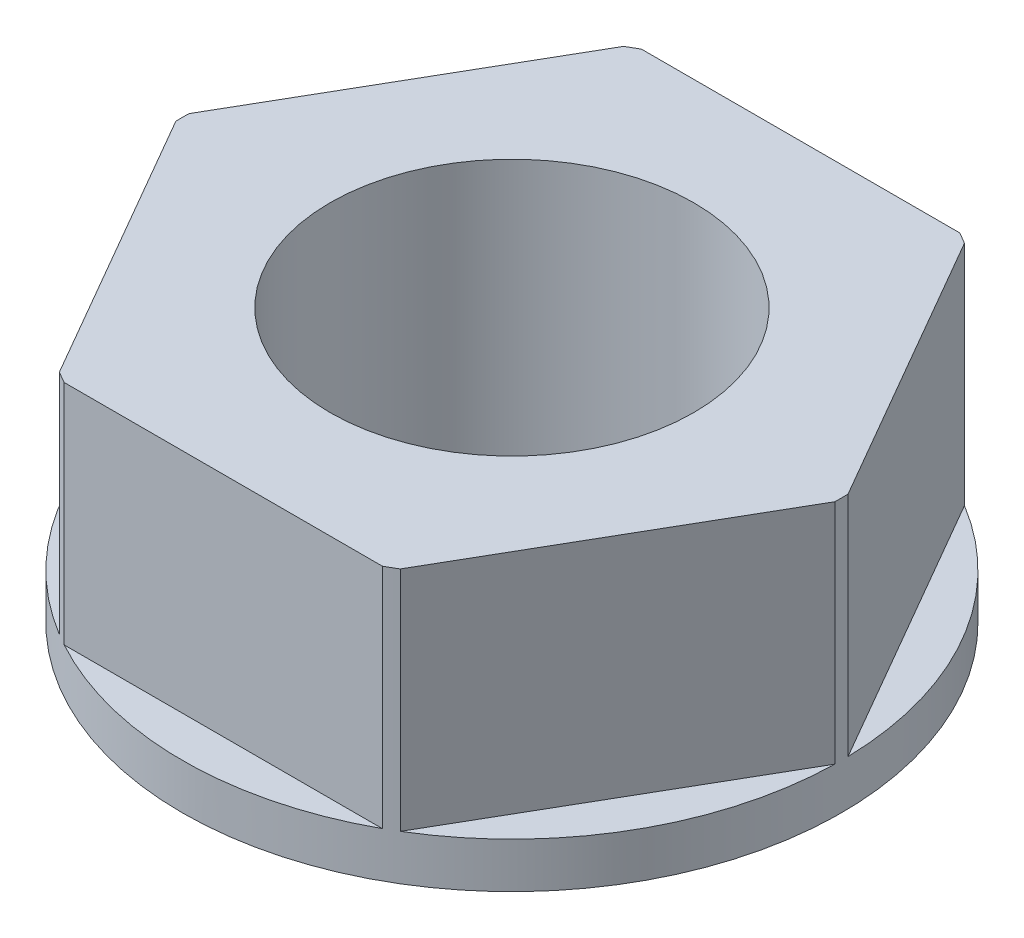
ISO-10303-21;
HEADER;
FILE_DESCRIPTION(('STEP AP214'),'2;1');
FILE_NAME('part.step','',(''),(''),'','','');
FILE_SCHEMA(('AUTOMOTIVE_DESIGN { 1 0 10303 214 1 1 1 1 }'));
ENDSEC;
DATA;
#1=APPLICATION_CONTEXT('core data for automotive mechanical design processes');
#2=APPLICATION_PROTOCOL_DEFINITION('international standard','automotive_design',2000,#1);
#3=PRODUCT_CONTEXT('',#1,'mechanical');
#4=PRODUCT('Part','Part','',(#3));
#5=PRODUCT_RELATED_PRODUCT_CATEGORY('part','',(#4));
#6=PRODUCT_DEFINITION_FORMATION('','',#4);
#7=PRODUCT_DEFINITION_CONTEXT('part definition',#1,'design');
#8=PRODUCT_DEFINITION('design','',#6,#7);
#9=PRODUCT_DEFINITION_SHAPE('','',#8);
#10=(LENGTH_UNIT() NAMED_UNIT(*) SI_UNIT(.MILLI.,.METRE.));
#11=(NAMED_UNIT(*) PLANE_ANGLE_UNIT() SI_UNIT($,.RADIAN.));
#12=(NAMED_UNIT(*) SI_UNIT($,.STERADIAN.) SOLID_ANGLE_UNIT());
#13=UNCERTAINTY_MEASURE_WITH_UNIT(LENGTH_MEASURE(1.E-05),#10,'distance_accuracy_value','');
#14=(GEOMETRIC_REPRESENTATION_CONTEXT(3) GLOBAL_UNCERTAINTY_ASSIGNED_CONTEXT((#13)) GLOBAL_UNIT_ASSIGNED_CONTEXT((#10,
#11,#12)) REPRESENTATION_CONTEXT('',''));
#15=CARTESIAN_POINT('',(0.,0.,0.));
#16=DIRECTION('',(0.,0.,1.));
#17=DIRECTION('',(1.,0.,0.));
#18=AXIS2_PLACEMENT_3D('',#15,#16,#17);
#19=CARTESIAN_POINT('',(0.,1.,0.));
#20=DIRECTION('',(0.,1.,0.));
#21=DIRECTION('',(0.,0.,1.));
#22=AXIS2_PLACEMENT_3D('',#19,#20,#21);
#23=PLANE('',#22);
#24=DIRECTION('',(0.5,0.,-0.866025403784439));
#25=VECTOR('',#24,1.);
#26=CARTESIAN_POINT('',(5.49926131403119,1.,3.175));
#27=LINE('',#26,#25);
#28=CARTESIAN_POINT('',(3.7499757455776,1.,6.20485148150862));
#29=VERTEX_POINT('',#28);
#30=CARTESIAN_POINT('',(7.24854688248478,1.,0.145148518491378));
#31=VERTEX_POINT('',#30);
#32=EDGE_CURVE('E155',#29,#31,#27,.T.);
#33=ORIENTED_EDGE('',*,*,#32,.F.);
#34=CARTESIAN_POINT('',(0.,1.,0.));
#35=DIRECTION('',(0.,1.,0.));
#36=DIRECTION('',(0.,0.,1.));
#37=AXIS2_PLACEMENT_3D('',#34,#35,#36);
#38=CIRCLE('',#37,7.25);
#39=EDGE_CURVE('E11',#29,#31,#38,.T.);
#40=ORIENTED_EDGE('',*,*,#39,.T.);
#41=EDGE_LOOP('',(#33,#40));
#42=FACE_BOUND('',#41,.T.);
#43=ADVANCED_FACE('F45',(#42),#23,.T.);
#44=DIRECTION('',(1.,0.,0.));
#45=VECTOR('',#44,1.);
#46=CARTESIAN_POINT('',(0.,1.,6.35));
#47=LINE('',#46,#45);
#48=CARTESIAN_POINT('',(-3.49857113690718,1.,6.35));
#49=VERTEX_POINT('',#48);
#50=CARTESIAN_POINT('',(3.49857113690718,1.,6.35));
#51=VERTEX_POINT('',#50);
#52=EDGE_CURVE('E61',#49,#51,#47,.T.);
#53=ORIENTED_EDGE('',*,*,#52,.F.);
#54=EDGE_CURVE('E55',#49,#51,#38,.T.);
#55=ORIENTED_EDGE('',*,*,#54,.T.);
#56=EDGE_LOOP('',(#53,#55));
#57=FACE_BOUND('',#56,.T.);
#58=ADVANCED_FACE('F257',(#57),#23,.T.);
#59=DIRECTION('',(0.5,0.,0.866025403784439));
#60=VECTOR('',#59,1.);
#61=CARTESIAN_POINT('',(-5.49926131403118,1.,3.175));
#62=LINE('',#61,#60);
#63=CARTESIAN_POINT('',(-7.24854688248478,1.,0.145148518491375));
#64=VERTEX_POINT('',#63);
#65=CARTESIAN_POINT('',(-3.74997574557759,1.,6.20485148150863));
#66=VERTEX_POINT('',#65);
#67=EDGE_CURVE('E211',#64,#66,#62,.T.);
#68=ORIENTED_EDGE('',*,*,#67,.F.);
#69=EDGE_CURVE('E68',#64,#66,#38,.T.);
#70=ORIENTED_EDGE('',*,*,#69,.T.);
#71=EDGE_LOOP('',(#68,#70));
#72=FACE_BOUND('',#71,.T.);
#73=ADVANCED_FACE('F262',(#72),#23,.T.);
#74=DIRECTION('',(-0.5,0.,0.866025403784439));
#75=VECTOR('',#74,1.);
#76=CARTESIAN_POINT('',(-5.49926131403119,1.,-3.175));
#77=LINE('',#76,#75);
#78=CARTESIAN_POINT('',(-3.7499757455776,1.,-6.20485148150862));
#79=VERTEX_POINT('',#78);
#80=CARTESIAN_POINT('',(-7.24854688248478,1.,-0.145148518491382));
#81=VERTEX_POINT('',#80);
#82=EDGE_CURVE('E209',#79,#81,#77,.T.);
#83=ORIENTED_EDGE('',*,*,#82,.F.);
#84=EDGE_CURVE('E166',#79,#81,#38,.T.);
#85=ORIENTED_EDGE('',*,*,#84,.T.);
#86=EDGE_LOOP('',(#83,#85));
#87=FACE_BOUND('',#86,.T.);
#88=ADVANCED_FACE('F274',(#87),#23,.T.);
#89=DIRECTION('',(-1.,0.,0.));
#90=VECTOR('',#89,1.);
#91=CARTESIAN_POINT('',(0.,1.,-6.35));
#92=LINE('',#91,#90);
#93=CARTESIAN_POINT('',(3.49857113690718,1.,-6.35));
#94=VERTEX_POINT('',#93);
#95=CARTESIAN_POINT('',(-3.49857113690718,1.,-6.35));
#96=VERTEX_POINT('',#95);
#97=EDGE_CURVE('E177',#94,#96,#92,.T.);
#98=ORIENTED_EDGE('',*,*,#97,.F.);
#99=EDGE_CURVE('E167',#94,#96,#38,.T.);
#100=ORIENTED_EDGE('',*,*,#99,.T.);
#101=EDGE_LOOP('',(#98,#100));
#102=FACE_BOUND('',#101,.T.);
#103=ADVANCED_FACE('F266',(#102),#23,.T.);
#104=CARTESIAN_POINT('',(0.,1.,0.));
#105=DIRECTION('',(0.,-1.,0.));
#106=DIRECTION('',(0.,0.,-1.));
#107=AXIS2_PLACEMENT_3D('',#104,#105,#106);
#108=CYLINDRICAL_SURFACE('',#107,7.25);
#109=ORIENTED_EDGE('',*,*,#39,.F.);
#110=DIRECTION('',(0.,-1.,0.));
#111=VECTOR('',#110,1.);
#112=CARTESIAN_POINT('',(3.7499757455776,6.,6.20485148150862));
#113=LINE('',#112,#111);
#114=CARTESIAN_POINT('',(3.7499757455776,6.,6.20485148150862));
#115=VERTEX_POINT('',#114);
#116=EDGE_CURVE('E205',#115,#29,#113,.T.);
#117=ORIENTED_EDGE('',*,*,#116,.F.);
#118=CARTESIAN_POINT('',(0.,6.,0.));
#119=DIRECTION('',(0.,1.,0.));
#120=DIRECTION('',(0.,0.,1.));
#121=AXIS2_PLACEMENT_3D('',#118,#119,#120);
#122=CIRCLE('',#121,7.25);
#123=CARTESIAN_POINT('',(3.49857113690718,6.,6.35));
#124=VERTEX_POINT('',#123);
#125=EDGE_CURVE('E157',#124,#115,#122,.T.);
#126=ORIENTED_EDGE('',*,*,#125,.F.);
#127=DIRECTION('',(0.,-1.,0.));
#128=VECTOR('',#127,1.);
#129=CARTESIAN_POINT('',(3.49857113690718,6.,6.35));
#130=LINE('',#129,#128);
#131=EDGE_CURVE('E218',#124,#51,#130,.T.);
#132=ORIENTED_EDGE('',*,*,#131,.T.);
#133=ORIENTED_EDGE('',*,*,#54,.F.);
#134=DIRECTION('',(0.,-1.,0.));
#135=VECTOR('',#134,1.);
#136=CARTESIAN_POINT('',(-3.49857113690718,6.,6.35));
#137=LINE('',#136,#135);
#138=CARTESIAN_POINT('',(-3.49857113690718,6.,6.35));
#139=VERTEX_POINT('',#138);
#140=EDGE_CURVE('E221',#139,#49,#137,.T.);
#141=ORIENTED_EDGE('',*,*,#140,.F.);
#142=CARTESIAN_POINT('',(-3.74997574557759,6.,6.20485148150863));
#143=VERTEX_POINT('',#142);
#144=EDGE_CURVE('E193',#143,#139,#122,.T.);
#145=ORIENTED_EDGE('',*,*,#144,.F.);
#146=DIRECTION('',(0.,-1.,0.));
#147=VECTOR('',#146,1.);
#148=CARTESIAN_POINT('',(-3.74997574557759,6.,6.20485148150863));
#149=LINE('',#148,#147);
#150=EDGE_CURVE('E224',#143,#66,#149,.T.);
#151=ORIENTED_EDGE('',*,*,#150,.T.);
#152=ORIENTED_EDGE('',*,*,#69,.F.);
#153=DIRECTION('',(0.,-1.,0.));
#154=VECTOR('',#153,1.);
#155=CARTESIAN_POINT('',(-7.24854688248478,6.,0.145148518491375));
#156=LINE('',#155,#154);
#157=CARTESIAN_POINT('',(-7.24854688248478,6.,0.145148518491375));
#158=VERTEX_POINT('',#157);
#159=EDGE_CURVE('E227',#158,#64,#156,.T.);
#160=ORIENTED_EDGE('',*,*,#159,.F.);
#161=CARTESIAN_POINT('',(-7.24854688248478,6.,-0.145148518491382));
#162=VERTEX_POINT('',#161);
#163=EDGE_CURVE('E188',#162,#158,#122,.T.);
#164=ORIENTED_EDGE('',*,*,#163,.F.);
#165=DIRECTION('',(0.,-1.,0.));
#166=VECTOR('',#165,1.);
#167=CARTESIAN_POINT('',(-7.24854688248478,6.,-0.145148518491382));
#168=LINE('',#167,#166);
#169=EDGE_CURVE('E230',#162,#81,#168,.T.);
#170=ORIENTED_EDGE('',*,*,#169,.T.);
#171=ORIENTED_EDGE('',*,*,#84,.F.);
#172=DIRECTION('',(0.,-1.,0.));
#173=VECTOR('',#172,1.);
#174=CARTESIAN_POINT('',(-3.7499757455776,6.,-6.20485148150862));
#175=LINE('',#174,#173);
#176=CARTESIAN_POINT('',(-3.7499757455776,6.,-6.20485148150862));
#177=VERTEX_POINT('',#176);
#178=EDGE_CURVE('E233',#177,#79,#175,.T.);
#179=ORIENTED_EDGE('',*,*,#178,.F.);
#180=CARTESIAN_POINT('',(-3.49857113690718,6.,-6.35));
#181=VERTEX_POINT('',#180);
#182=EDGE_CURVE('E184',#181,#177,#122,.T.);
#183=ORIENTED_EDGE('',*,*,#182,.F.);
#184=DIRECTION('',(0.,-1.,0.));
#185=VECTOR('',#184,1.);
#186=CARTESIAN_POINT('',(-3.49857113690718,6.,-6.35));
#187=LINE('',#186,#185);
#188=EDGE_CURVE('E236',#181,#96,#187,.T.);
#189=ORIENTED_EDGE('',*,*,#188,.T.);
#190=ORIENTED_EDGE('',*,*,#99,.F.);
#191=DIRECTION('',(0.,-1.,0.));
#192=VECTOR('',#191,1.);
#193=CARTESIAN_POINT('',(3.49857113690718,6.,-6.35));
#194=LINE('',#193,#192);
#195=CARTESIAN_POINT('',(3.49857113690718,6.,-6.35));
#196=VERTEX_POINT('',#195);
#197=EDGE_CURVE('E163',#196,#94,#194,.T.);
#198=ORIENTED_EDGE('',*,*,#197,.F.);
#199=CARTESIAN_POINT('',(3.74997574557759,6.,-6.20485148150863));
#200=VERTEX_POINT('',#199);
#201=EDGE_CURVE('E145',#200,#196,#122,.T.);
#202=ORIENTED_EDGE('',*,*,#201,.F.);
#203=DIRECTION('',(0.,-1.,0.));
#204=VECTOR('',#203,1.);
#205=CARTESIAN_POINT('',(3.74997574557759,6.,-6.20485148150863));
#206=LINE('',#205,#204);
#207=CARTESIAN_POINT('',(3.74997574557759,1.,-6.20485148150863));
#208=VERTEX_POINT('',#207);
#209=EDGE_CURVE('E142',#200,#208,#206,.T.);
#210=ORIENTED_EDGE('',*,*,#209,.T.);
#211=CARTESIAN_POINT('',(7.24854688248478,1.,-0.14514851849138));
#212=VERTEX_POINT('',#211);
#213=EDGE_CURVE('E54',#212,#208,#38,.T.);
#214=ORIENTED_EDGE('',*,*,#213,.F.);
#215=DIRECTION('',(0.,-1.,0.));
#216=VECTOR('',#215,1.);
#217=CARTESIAN_POINT('',(7.24854688248478,6.,-0.14514851849138));
#218=LINE('',#217,#216);
#219=CARTESIAN_POINT('',(7.24854688248478,6.,-0.14514851849138));
#220=VERTEX_POINT('',#219);
#221=EDGE_CURVE('E140',#220,#212,#218,.T.);
#222=ORIENTED_EDGE('',*,*,#221,.F.);
#223=CARTESIAN_POINT('',(7.24854688248478,6.,0.145148518491378));
#224=VERTEX_POINT('',#223);
#225=EDGE_CURVE('E146',#224,#220,#122,.T.);
#226=ORIENTED_EDGE('',*,*,#225,.F.);
#227=DIRECTION('',(0.,-1.,0.));
#228=VECTOR('',#227,1.);
#229=CARTESIAN_POINT('',(7.24854688248478,6.,0.145148518491378));
#230=LINE('',#229,#228);
#231=EDGE_CURVE('E203',#224,#31,#230,.T.);
#232=ORIENTED_EDGE('',*,*,#231,.T.);
#233=EDGE_LOOP('',(#109,#117,#126,#132,#133,#141,#145,#151,#152,#160,#164,#170,#171,#179,#183,
#189,#190,#198,#202,#210,#214,#222,#226,#232));
#234=FACE_BOUND('',#233,.T.);
#235=CARTESIAN_POINT('',(0.,0.,0.));
#236=DIRECTION('',(0.,1.,0.));
#237=DIRECTION('',(0.,0.,1.));
#238=AXIS2_PLACEMENT_3D('',#235,#236,#237);
#239=CIRCLE('',#238,7.25);
#240=CARTESIAN_POINT('',(0.,0.,7.25));
#241=VERTEX_POINT('',#240);
#242=EDGE_CURVE('E49',#241,#241,#239,.T.);
#243=ORIENTED_EDGE('',*,*,#242,.T.);
#244=EDGE_LOOP('',(#243));
#245=FACE_BOUND('',#244,.T.);
#246=ADVANCED_FACE('F47',(#234,#245),#108,.T.);
#247=DIRECTION('',(-0.5,0.,-0.866025403784438));
#248=VECTOR('',#247,1.);
#249=CARTESIAN_POINT('',(5.49926131403118,1.,-3.175));
#250=LINE('',#249,#248);
#251=EDGE_CURVE('E176',#212,#208,#250,.T.);
#252=ORIENTED_EDGE('',*,*,#251,.F.);
#253=ORIENTED_EDGE('',*,*,#213,.T.);
#254=EDGE_LOOP('',(#252,#253));
#255=FACE_BOUND('',#254,.T.);
#256=ADVANCED_FACE('F175',(#255),#23,.T.);
#257=CARTESIAN_POINT('',(0.,0.,0.));
#258=DIRECTION('',(0.,1.,0.));
#259=DIRECTION('',(0.,0.,1.));
#260=AXIS2_PLACEMENT_3D('',#257,#258,#259);
#261=PLANE('',#260);
#262=CARTESIAN_POINT('',(0.,0.,0.));
#263=DIRECTION('',(0.,1.,0.));
#264=DIRECTION('',(0.,0.,1.));
#265=AXIS2_PLACEMENT_3D('',#262,#263,#264);
#266=CIRCLE('',#265,4.);
#267=CARTESIAN_POINT('',(0.,0.,4.));
#268=VERTEX_POINT('',#267);
#269=EDGE_CURVE('E178',#268,#268,#266,.T.);
#270=ORIENTED_EDGE('',*,*,#269,.T.);
#271=EDGE_LOOP('',(#270));
#272=FACE_BOUND('',#271,.T.);
#273=ORIENTED_EDGE('',*,*,#242,.F.);
#274=EDGE_LOOP('',(#273));
#275=FACE_BOUND('',#274,.T.);
#276=ADVANCED_FACE('F265',(#272,#275),#261,.F.);
#277=CARTESIAN_POINT('',(5.49926131403118,6.,-3.175));
#278=DIRECTION('',(-0.866025403784438,0.,0.5));
#279=DIRECTION('',(0.5,0.,0.866025403784438));
#280=AXIS2_PLACEMENT_3D('',#277,#278,#279);
#281=PLANE('',#280);
#282=ORIENTED_EDGE('',*,*,#251,.T.);
#283=ORIENTED_EDGE('',*,*,#209,.F.);
#284=DIRECTION('',(-0.5,0.,-0.866025403784438));
#285=VECTOR('',#284,1.);
#286=CARTESIAN_POINT('',(5.49926131403118,6.,-3.175));
#287=LINE('',#286,#285);
#288=EDGE_CURVE('E135',#220,#200,#287,.T.);
#289=ORIENTED_EDGE('',*,*,#288,.F.);
#290=ORIENTED_EDGE('',*,*,#221,.T.);
#291=EDGE_LOOP('',(#282,#283,#289,#290));
#292=FACE_BOUND('',#291,.T.);
#293=ADVANCED_FACE('F138',(#292),#281,.F.);
#294=CARTESIAN_POINT('',(0.,6.,-6.35));
#295=DIRECTION('',(0.,0.,1.));
#296=DIRECTION('',(1.,0.,0.));
#297=AXIS2_PLACEMENT_3D('',#294,#295,#296);
#298=PLANE('',#297);
#299=ORIENTED_EDGE('',*,*,#97,.T.);
#300=ORIENTED_EDGE('',*,*,#188,.F.);
#301=DIRECTION('',(-1.,0.,0.));
#302=VECTOR('',#301,1.);
#303=CARTESIAN_POINT('',(0.,6.,-6.35));
#304=LINE('',#303,#302);
#305=EDGE_CURVE('E183',#196,#181,#304,.T.);
#306=ORIENTED_EDGE('',*,*,#305,.F.);
#307=ORIENTED_EDGE('',*,*,#197,.T.);
#308=EDGE_LOOP('',(#299,#300,#306,#307));
#309=FACE_BOUND('',#308,.T.);
#310=ADVANCED_FACE('F239',(#309),#298,.F.);
#311=CARTESIAN_POINT('',(-5.49926131403119,6.,-3.175));
#312=DIRECTION('',(0.866025403784439,0.,0.5));
#313=DIRECTION('',(0.5,0.,-0.866025403784439));
#314=AXIS2_PLACEMENT_3D('',#311,#312,#313);
#315=PLANE('',#314);
#316=ORIENTED_EDGE('',*,*,#82,.T.);
#317=ORIENTED_EDGE('',*,*,#169,.F.);
#318=DIRECTION('',(-0.5,0.,0.866025403784439));
#319=VECTOR('',#318,1.);
#320=CARTESIAN_POINT('',(-5.49926131403119,6.,-3.175));
#321=LINE('',#320,#319);
#322=EDGE_CURVE('E187',#177,#162,#321,.T.);
#323=ORIENTED_EDGE('',*,*,#322,.F.);
#324=ORIENTED_EDGE('',*,*,#178,.T.);
#325=EDGE_LOOP('',(#316,#317,#323,#324));
#326=FACE_BOUND('',#325,.T.);
#327=ADVANCED_FACE('F244',(#326),#315,.F.);
#328=CARTESIAN_POINT('',(-5.49926131403118,6.,3.175));
#329=DIRECTION('',(0.866025403784439,0.,-0.5));
#330=DIRECTION('',(-0.5,0.,-0.866025403784439));
#331=AXIS2_PLACEMENT_3D('',#328,#329,#330);
#332=PLANE('',#331);
#333=ORIENTED_EDGE('',*,*,#67,.T.);
#334=ORIENTED_EDGE('',*,*,#150,.F.);
#335=DIRECTION('',(0.5,0.,0.866025403784439));
#336=VECTOR('',#335,1.);
#337=CARTESIAN_POINT('',(-5.49926131403118,6.,3.175));
#338=LINE('',#337,#336);
#339=EDGE_CURVE('E192',#158,#143,#338,.T.);
#340=ORIENTED_EDGE('',*,*,#339,.F.);
#341=ORIENTED_EDGE('',*,*,#159,.T.);
#342=EDGE_LOOP('',(#333,#334,#340,#341));
#343=FACE_BOUND('',#342,.T.);
#344=ADVANCED_FACE('F248',(#343),#332,.F.);
#345=CARTESIAN_POINT('',(0.,6.,6.35));
#346=DIRECTION('',(0.,0.,-1.));
#347=DIRECTION('',(-1.,0.,0.));
#348=AXIS2_PLACEMENT_3D('',#345,#346,#347);
#349=PLANE('',#348);
#350=ORIENTED_EDGE('',*,*,#52,.T.);
#351=ORIENTED_EDGE('',*,*,#131,.F.);
#352=DIRECTION('',(1.,0.,0.));
#353=VECTOR('',#352,1.);
#354=CARTESIAN_POINT('',(0.,6.,6.35));
#355=LINE('',#354,#353);
#356=EDGE_CURVE('E197',#139,#124,#355,.T.);
#357=ORIENTED_EDGE('',*,*,#356,.F.);
#358=ORIENTED_EDGE('',*,*,#140,.T.);
#359=EDGE_LOOP('',(#350,#351,#357,#358));
#360=FACE_BOUND('',#359,.T.);
#361=ADVANCED_FACE('F252',(#360),#349,.F.);
#362=CARTESIAN_POINT('',(5.49926131403119,6.,3.175));
#363=DIRECTION('',(-0.866025403784439,0.,-0.5));
#364=DIRECTION('',(-0.5,0.,0.866025403784439));
#365=AXIS2_PLACEMENT_3D('',#362,#363,#364);
#366=PLANE('',#365);
#367=ORIENTED_EDGE('',*,*,#32,.T.);
#368=ORIENTED_EDGE('',*,*,#231,.F.);
#369=DIRECTION('',(0.5,0.,-0.866025403784439));
#370=VECTOR('',#369,1.);
#371=CARTESIAN_POINT('',(5.49926131403119,6.,3.175));
#372=LINE('',#371,#370);
#373=EDGE_CURVE('E151',#115,#224,#372,.T.);
#374=ORIENTED_EDGE('',*,*,#373,.F.);
#375=ORIENTED_EDGE('',*,*,#116,.T.);
#376=EDGE_LOOP('',(#367,#368,#374,#375));
#377=FACE_BOUND('',#376,.T.);
#378=ADVANCED_FACE('F254',(#377),#366,.F.);
#379=CARTESIAN_POINT('',(0.,6.,0.));
#380=DIRECTION('',(0.,1.,0.));
#381=DIRECTION('',(0.,0.,1.));
#382=AXIS2_PLACEMENT_3D('',#379,#380,#381);
#383=PLANE('',#382);
#384=CARTESIAN_POINT('',(0.,6.,0.));
#385=DIRECTION('',(0.,1.,0.));
#386=DIRECTION('',(0.,0.,1.));
#387=AXIS2_PLACEMENT_3D('',#384,#385,#386);
#388=CIRCLE('',#387,4.);
#389=CARTESIAN_POINT('',(0.,6.,4.));
#390=VERTEX_POINT('',#389);
#391=EDGE_CURVE('E423',#390,#390,#388,.T.);
#392=ORIENTED_EDGE('',*,*,#391,.F.);
#393=EDGE_LOOP('',(#392));
#394=FACE_BOUND('',#393,.T.);
#395=ORIENTED_EDGE('',*,*,#225,.T.);
#396=ORIENTED_EDGE('',*,*,#288,.T.);
#397=ORIENTED_EDGE('',*,*,#201,.T.);
#398=ORIENTED_EDGE('',*,*,#305,.T.);
#399=ORIENTED_EDGE('',*,*,#182,.T.);
#400=ORIENTED_EDGE('',*,*,#322,.T.);
#401=ORIENTED_EDGE('',*,*,#163,.T.);
#402=ORIENTED_EDGE('',*,*,#339,.T.);
#403=ORIENTED_EDGE('',*,*,#144,.T.);
#404=ORIENTED_EDGE('',*,*,#356,.T.);
#405=ORIENTED_EDGE('',*,*,#125,.T.);
#406=ORIENTED_EDGE('',*,*,#373,.T.);
#407=EDGE_LOOP('',(#395,#396,#397,#398,#399,#400,#401,#402,#403,#404,#405,#406));
#408=FACE_BOUND('',#407,.T.);
#409=ADVANCED_FACE('F149',(#394,#408),#383,.T.);
#410=CARTESIAN_POINT('',(0.,0.,0.));
#411=DIRECTION('',(0.,1.,0.));
#412=DIRECTION('',(0.,0.,1.));
#413=AXIS2_PLACEMENT_3D('',#410,#411,#412);
#414=CYLINDRICAL_SURFACE('',#413,4.);
#415=ORIENTED_EDGE('',*,*,#269,.F.);
#416=EDGE_LOOP('',(#415));
#417=FACE_BOUND('',#416,.T.);
#418=ORIENTED_EDGE('',*,*,#391,.T.);
#419=EDGE_LOOP('',(#418));
#420=FACE_BOUND('',#419,.T.);
#421=ADVANCED_FACE('F404',(#417,#420),#414,.F.);
#422=CLOSED_SHELL('',(#43,#58,#73,#88,#103,#246,#256,#276,#293,#310,#327,#344,#361,#378,#409,#421));
#423=MANIFOLD_SOLID_BREP('B2',#422);
#424=ADVANCED_BREP_SHAPE_REPRESENTATION('',(#18,#423),#14);
#425=SHAPE_DEFINITION_REPRESENTATION(#9,#424);
ENDSEC;
END-ISO-10303-21;
